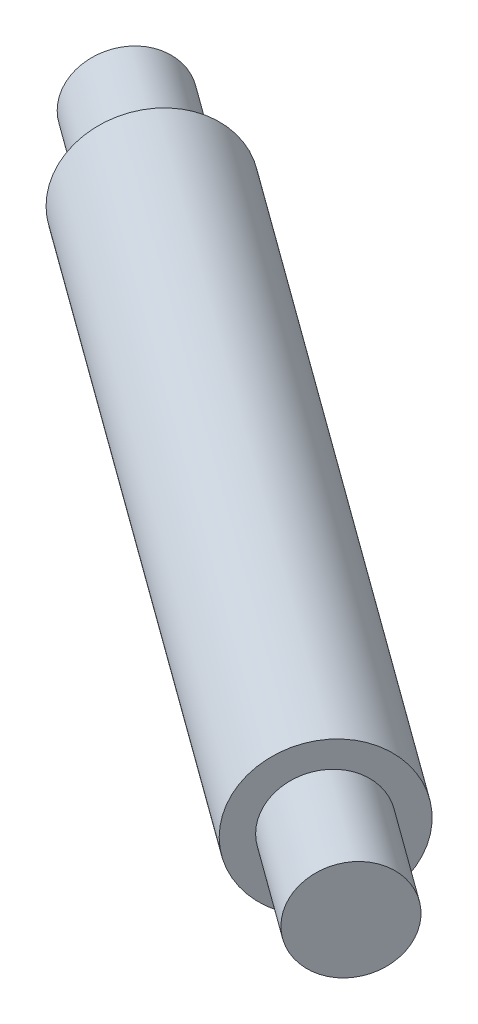
ISO-10303-21;
HEADER;
FILE_DESCRIPTION(('STEP AP214'),'2;1');
FILE_NAME('part.step','',(''),(''),'','','');
FILE_SCHEMA(('AUTOMOTIVE_DESIGN { 1 0 10303 214 1 1 1 1 }'));
ENDSEC;
DATA;
#1=APPLICATION_CONTEXT('core data for automotive mechanical design processes');
#2=APPLICATION_PROTOCOL_DEFINITION('international standard','automotive_design',2000,#1);
#3=PRODUCT_CONTEXT('',#1,'mechanical');
#4=PRODUCT('Part','Part','',(#3));
#5=PRODUCT_RELATED_PRODUCT_CATEGORY('part','',(#4));
#6=PRODUCT_DEFINITION_FORMATION('','',#4);
#7=PRODUCT_DEFINITION_CONTEXT('part definition',#1,'design');
#8=PRODUCT_DEFINITION('design','',#6,#7);
#9=PRODUCT_DEFINITION_SHAPE('','',#8);
#10=(LENGTH_UNIT() NAMED_UNIT(*) SI_UNIT(.MILLI.,.METRE.));
#11=(NAMED_UNIT(*) PLANE_ANGLE_UNIT() SI_UNIT($,.RADIAN.));
#12=(NAMED_UNIT(*) SI_UNIT($,.STERADIAN.) SOLID_ANGLE_UNIT());
#13=UNCERTAINTY_MEASURE_WITH_UNIT(LENGTH_MEASURE(1.E-05),#10,'distance_accuracy_value','');
#14=(GEOMETRIC_REPRESENTATION_CONTEXT(3) GLOBAL_UNCERTAINTY_ASSIGNED_CONTEXT((#13)) GLOBAL_UNIT_ASSIGNED_CONTEXT((#10,
#11,#12)) REPRESENTATION_CONTEXT('',''));
#15=CARTESIAN_POINT('',(0.,0.,0.));
#16=DIRECTION('',(0.,0.,1.));
#17=DIRECTION('',(1.,0.,0.));
#18=AXIS2_PLACEMENT_3D('',#15,#16,#17);
#19=CARTESIAN_POINT('',(-3.936266367689,7.802709104713,26.68407607145));
#20=DIRECTION('',(-0.809016994375526,0.,-0.587785252291677));
#21=DIRECTION('',(0.587785252291677,0.,-0.809016994375526));
#22=AXIS2_PLACEMENT_3D('',#19,#20,#21);
#23=PLANE('',#22);
#24=CARTESIAN_POINT('',(-3.17214553970825,6.5,25.6323539787648));
#25=DIRECTION('',(-0.809016994376145,0.,-0.587785252290824));
#26=DIRECTION('',(-0.587785252290824,0.,0.809016994376145));
#27=AXIS2_PLACEMENT_3D('',#24,#25,#26);
#28=CIRCLE('',#27,1.25000000000609);
#29=CARTESIAN_POINT('',(-3.90687710507536,6.5,26.6436252217399));
#30=VERTEX_POINT('',#29);
#31=EDGE_CURVE('E19',#30,#30,#28,.F.);
#32=ORIENTED_EDGE('',*,*,#31,.T.);
#33=EDGE_LOOP('',(#32));
#34=FACE_BOUND('',#33,.T.);
#35=ADVANCED_FACE('F15',(#34),#23,.F.);
#36=CARTESIAN_POINT('',(-3.17214553970825,6.5,25.6323539787648));
#37=DIRECTION('',(-0.809016994376145,0.,-0.587785252290824));
#38=DIRECTION('',(-0.587785252290824,0.,0.809016994376145));
#39=AXIS2_PLACEMENT_3D('',#36,#37,#38);
#40=CYLINDRICAL_SURFACE('',#39,1.25000000000609);
#41=CARTESIAN_POINT('',(-5.47784397368307,6.5,23.9571660097339));
#42=DIRECTION('',(-0.809016994376145,0.,-0.587785252290824));
#43=DIRECTION('',(-0.587785252290824,0.,0.809016994376145));
#44=AXIS2_PLACEMENT_3D('',#41,#42,#43);
#45=CIRCLE('',#44,1.25000000000609);
#46=CARTESIAN_POINT('',(-6.21257553905018,6.5,24.968437252709));
#47=VERTEX_POINT('',#46);
#48=EDGE_CURVE('E35',#47,#47,#45,.F.);
#49=ORIENTED_EDGE('',*,*,#48,.T.);
#50=EDGE_LOOP('',(#49));
#51=FACE_BOUND('',#50,.T.);
#52=ORIENTED_EDGE('',*,*,#31,.F.);
#53=EDGE_LOOP('',(#52));
#54=FACE_BOUND('',#53,.T.);
#55=ADVANCED_FACE('F43',(#51,#54),#40,.T.);
#56=CARTESIAN_POINT('',(-6.639307632207,8.479131998468,25.55578359061));
#57=DIRECTION('',(-0.809016994374947,0.,-0.587785252292473));
#58=DIRECTION('',(0.587785252292473,0.,-0.809016994374947));
#59=AXIS2_PLACEMENT_3D('',#56,#57,#58);
#60=PLANE('',#59);
#61=ORIENTED_EDGE('',*,*,#48,.F.);
#62=EDGE_LOOP('',(#61));
#63=FACE_BOUND('',#62,.T.);
#64=CARTESIAN_POINT('',(-5.47784397367775,6.5,23.9571660097378));
#65=DIRECTION('',(-0.809016994376145,0.,-0.587785252290824));
#66=DIRECTION('',(-0.587785252290824,0.,0.809016994376145));
#67=AXIS2_PLACEMENT_3D('',#64,#65,#66);
#68=CIRCLE('',#67,1.90000000002713);
#69=CARTESIAN_POINT('',(-6.59463595304626,6.5,25.4942982990744));
#70=VERTEX_POINT('',#69);
#71=EDGE_CURVE('E33',#70,#70,#68,.F.);
#72=ORIENTED_EDGE('',*,*,#71,.T.);
#73=EDGE_LOOP('',(#72));
#74=FACE_BOUND('',#73,.T.);
#75=ADVANCED_FACE('F45',(#63,#74),#60,.F.);
#76=CARTESIAN_POINT('',(-5.47784397367775,6.5,23.9571660097378));
#77=DIRECTION('',(-0.809016994376145,0.,-0.587785252290824));
#78=DIRECTION('',(-0.587785252290824,0.,0.809016994376145));
#79=AXIS2_PLACEMENT_3D('',#76,#77,#78);
#80=CYLINDRICAL_SURFACE('',#79,1.90000000002713);
#81=CARTESIAN_POINT('',(-21.2536753640232,6.5,12.495353590059));
#82=DIRECTION('',(-0.809016994376145,0.,-0.587785252290824));
#83=DIRECTION('',(-0.587785252290824,0.,0.809016994376145));
#84=AXIS2_PLACEMENT_3D('',#81,#82,#83);
#85=CIRCLE('',#84,1.90000000002713);
#86=CARTESIAN_POINT('',(-22.3704673433917,6.5,14.0324858793956));
#87=VERTEX_POINT('',#86);
#88=EDGE_CURVE('E28',#87,#87,#85,.F.);
#89=ORIENTED_EDGE('',*,*,#88,.T.);
#90=EDGE_LOOP('',(#89));
#91=FACE_BOUND('',#90,.T.);
#92=ORIENTED_EDGE('',*,*,#71,.F.);
#93=EDGE_LOOP('',(#92));
#94=FACE_BOUND('',#93,.T.);
#95=ADVANCED_FACE('F52',(#91,#94),#80,.T.);
#96=CARTESIAN_POINT('',(-22.41513902252,8.479131998468,14.09397117091));
#97=DIRECTION('',(-0.809016994374948,0.,-0.587785252292473));
#98=DIRECTION('',(0.587785252292473,0.,-0.809016994374947));
#99=AXIS2_PLACEMENT_3D('',#96,#97,#98);
#100=PLANE('',#99);
#101=CARTESIAN_POINT('',(-21.2536753640179,6.5,12.4953535900628));
#102=DIRECTION('',(-0.809016994376146,0.,-0.587785252290823));
#103=DIRECTION('',(-0.587785252290823,0.,0.809016994376146));
#104=AXIS2_PLACEMENT_3D('',#101,#102,#103);
#105=CIRCLE('',#104,1.25000000005618);
#106=CARTESIAN_POINT('',(-21.9884069294145,6.5,13.5066248330785));
#107=VERTEX_POINT('',#106);
#108=EDGE_CURVE('E23',#107,#107,#105,.F.);
#109=ORIENTED_EDGE('',*,*,#108,.T.);
#110=EDGE_LOOP('',(#109));
#111=FACE_BOUND('',#110,.T.);
#112=ORIENTED_EDGE('',*,*,#88,.F.);
#113=EDGE_LOOP('',(#112));
#114=FACE_BOUND('',#113,.T.);
#115=ADVANCED_FACE('F63',(#111,#114),#100,.T.);
#116=CARTESIAN_POINT('',(-21.2536753640179,6.5,12.4953535900628));
#117=DIRECTION('',(-0.809016994376146,0.,-0.587785252290823));
#118=DIRECTION('',(-0.587785252290823,0.,0.809016994376146));
#119=AXIS2_PLACEMENT_3D('',#116,#117,#118);
#120=CYLINDRICAL_SURFACE('',#119,1.25000000005618);
#121=CARTESIAN_POINT('',(-23.5593737979891,6.5,10.8201656210346));
#122=DIRECTION('',(-0.809016994376146,0.,-0.587785252290824));
#123=DIRECTION('',(-0.587785252290824,0.,0.809016994376146));
#124=AXIS2_PLACEMENT_3D('',#121,#122,#123);
#125=CIRCLE('',#124,1.25000000005619);
#126=CARTESIAN_POINT('',(-24.2941053633857,6.5,11.8314368640502));
#127=VERTEX_POINT('',#126);
#128=EDGE_CURVE('E10',#127,#127,#125,.F.);
#129=ORIENTED_EDGE('',*,*,#128,.T.);
#130=EDGE_LOOP('',(#129));
#131=FACE_BOUND('',#130,.T.);
#132=ORIENTED_EDGE('',*,*,#108,.F.);
#133=EDGE_LOOP('',(#132));
#134=FACE_BOUND('',#133,.T.);
#135=ADVANCED_FACE('F58',(#131,#134),#120,.T.);
#136=CARTESIAN_POINT('',(-24.32349462594,7.802709104713,11.87188771368));
#137=DIRECTION('',(-0.809016994375577,0.,-0.587785252291607));
#138=DIRECTION('',(0.587785252291607,0.,-0.809016994375577));
#139=AXIS2_PLACEMENT_3D('',#136,#137,#138);
#140=PLANE('',#139);
#141=ORIENTED_EDGE('',*,*,#128,.F.);
#142=EDGE_LOOP('',(#141));
#143=FACE_BOUND('',#142,.T.);
#144=ADVANCED_FACE('F17',(#143),#140,.T.);
#145=CLOSED_SHELL('',(#35,#55,#75,#95,#115,#135,#144));
#146=MANIFOLD_SOLID_BREP('B1',#145);
#147=ADVANCED_BREP_SHAPE_REPRESENTATION('',(#18,#146),#14);
#148=SHAPE_DEFINITION_REPRESENTATION(#9,#147);
ENDSEC;
END-ISO-10303-21;
